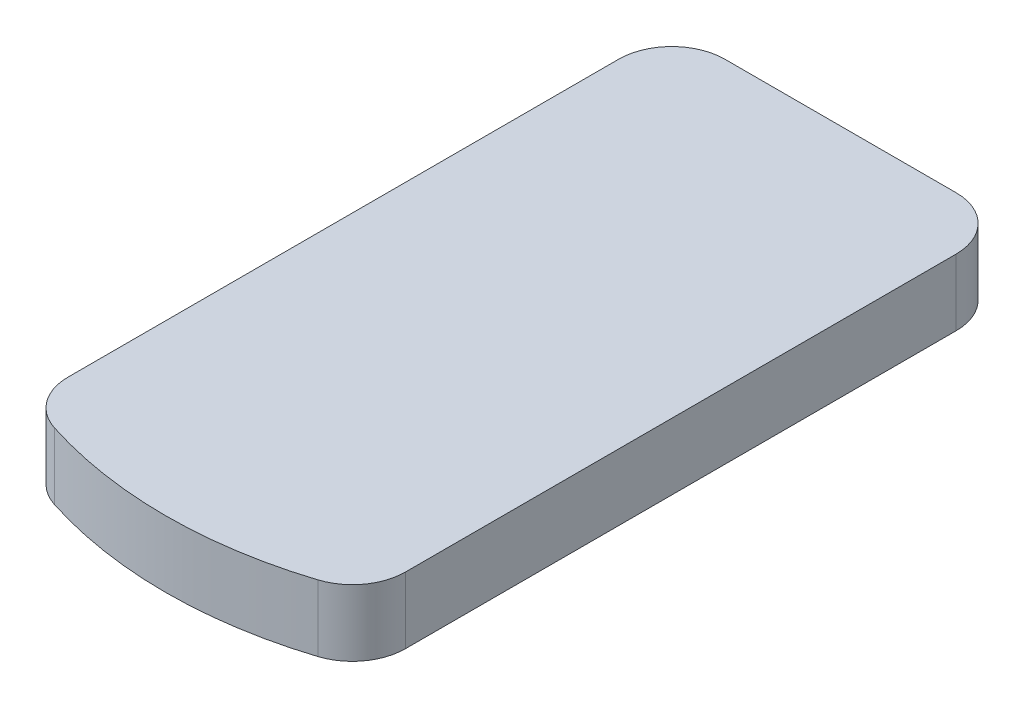
ISO-10303-21;
HEADER;
FILE_DESCRIPTION(('STEP AP214'),'2;1');
FILE_NAME('part.step','',(''),(''),'','','');
FILE_SCHEMA(('AUTOMOTIVE_DESIGN { 1 0 10303 214 1 1 1 1 }'));
ENDSEC;
DATA;
#1=APPLICATION_CONTEXT('core data for automotive mechanical design processes');
#2=APPLICATION_PROTOCOL_DEFINITION('international standard','automotive_design',2000,#1);
#3=PRODUCT_CONTEXT('',#1,'mechanical');
#4=PRODUCT('Part','Part','',(#3));
#5=PRODUCT_RELATED_PRODUCT_CATEGORY('part','',(#4));
#6=PRODUCT_DEFINITION_FORMATION('','',#4);
#7=PRODUCT_DEFINITION_CONTEXT('part definition',#1,'design');
#8=PRODUCT_DEFINITION('design','',#6,#7);
#9=PRODUCT_DEFINITION_SHAPE('','',#8);
#10=(LENGTH_UNIT() NAMED_UNIT(*) SI_UNIT(.MILLI.,.METRE.));
#11=(NAMED_UNIT(*) PLANE_ANGLE_UNIT() SI_UNIT($,.RADIAN.));
#12=(NAMED_UNIT(*) SI_UNIT($,.STERADIAN.) SOLID_ANGLE_UNIT());
#13=UNCERTAINTY_MEASURE_WITH_UNIT(LENGTH_MEASURE(1.E-05),#10,'distance_accuracy_value','');
#14=(GEOMETRIC_REPRESENTATION_CONTEXT(3) GLOBAL_UNCERTAINTY_ASSIGNED_CONTEXT((#13)) GLOBAL_UNIT_ASSIGNED_CONTEXT((#10,
#11,#12)) REPRESENTATION_CONTEXT('',''));
#15=CARTESIAN_POINT('',(0.,0.,0.));
#16=DIRECTION('',(0.,0.,1.));
#17=DIRECTION('',(1.,0.,0.));
#18=AXIS2_PLACEMENT_3D('',#15,#16,#17);
#19=CARTESIAN_POINT('',(-31.75,6.25,127.));
#20=DIRECTION('',(0.,-1.,0.));
#21=DIRECTION('',(0.,0.,-1.));
#22=AXIS2_PLACEMENT_3D('',#19,#20,#21);
#23=PLANE('',#22);
#24=DIRECTION('',(0.,0.,-1.));
#25=VECTOR('',#24,1.);
#26=CARTESIAN_POINT('',(-31.75,6.25,127.));
#27=LINE('',#26,#25);
#28=CARTESIAN_POINT('',(-31.75,6.25,113.598859454336));
#29=VERTEX_POINT('',#28);
#30=CARTESIAN_POINT('',(-31.75,6.25,9.99999999999999));
#31=VERTEX_POINT('',#30);
#32=EDGE_CURVE('E133',#29,#31,#27,.T.);
#33=ORIENTED_EDGE('',*,*,#32,.F.);
#34=CARTESIAN_POINT('',(-21.75,6.25000000000001,113.598859454336));
#35=DIRECTION('',(0.,-1.,0.));
#36=DIRECTION('',(0.,0.,-1.));
#37=AXIS2_PLACEMENT_3D('',#34,#35,#36);
#38=CIRCLE('',#37,10.);
#39=CARTESIAN_POINT('',(-24.8028348487516,6.25,123.121474609127));
#40=VERTEX_POINT('',#39);
#41=EDGE_CURVE('E115',#29,#40,#38,.F.);
#42=ORIENTED_EDGE('',*,*,#41,.T.);
#43=CARTESIAN_POINT('',(0.,6.25,45.7547441064685));
#44=DIRECTION('',(0.,1.,0.));
#45=DIRECTION('',(0.,0.,1.));
#46=AXIS2_PLACEMENT_3D('',#43,#44,#45);
#47=CIRCLE('',#46,81.2452558935315);
#48=CARTESIAN_POINT('',(24.8028348487516,6.25,123.121474609127));
#49=VERTEX_POINT('',#48);
#50=EDGE_CURVE('E182',#40,#49,#47,.T.);
#51=ORIENTED_EDGE('',*,*,#50,.T.);
#52=CARTESIAN_POINT('',(21.75,6.25000000000001,113.598859454336));
#53=DIRECTION('',(0.,-1.,0.));
#54=DIRECTION('',(0.,0.,-1.));
#55=AXIS2_PLACEMENT_3D('',#52,#53,#54);
#56=CIRCLE('',#55,10.);
#57=CARTESIAN_POINT('',(31.75,6.25,113.598859454336));
#58=VERTEX_POINT('',#57);
#59=EDGE_CURVE('E126',#49,#58,#56,.F.);
#60=ORIENTED_EDGE('',*,*,#59,.T.);
#61=DIRECTION('',(0.,0.,-1.));
#62=VECTOR('',#61,1.);
#63=CARTESIAN_POINT('',(31.75,6.25,127.));
#64=LINE('',#63,#62);
#65=CARTESIAN_POINT('',(31.75,6.25,9.99999999999999));
#66=VERTEX_POINT('',#65);
#67=EDGE_CURVE('E141',#58,#66,#64,.T.);
#68=ORIENTED_EDGE('',*,*,#67,.T.);
#69=CARTESIAN_POINT('',(21.75,6.25,9.99999999999999));
#70=DIRECTION('',(0.,-1.,0.));
#71=DIRECTION('',(0.,0.,-1.));
#72=AXIS2_PLACEMENT_3D('',#69,#70,#71);
#73=CIRCLE('',#72,10.);
#74=CARTESIAN_POINT('',(21.75,6.25,0.));
#75=VERTEX_POINT('',#74);
#76=EDGE_CURVE('E151',#66,#75,#73,.F.);
#77=ORIENTED_EDGE('',*,*,#76,.T.);
#78=DIRECTION('',(-1.,0.,0.));
#79=VECTOR('',#78,1.);
#80=CARTESIAN_POINT('',(-31.75,6.25,0.));
#81=LINE('',#80,#79);
#82=CARTESIAN_POINT('',(-21.75,6.25,0.));
#83=VERTEX_POINT('',#82);
#84=EDGE_CURVE('E170',#75,#83,#81,.T.);
#85=ORIENTED_EDGE('',*,*,#84,.T.);
#86=CARTESIAN_POINT('',(-21.75,6.25,9.99999999999999));
#87=DIRECTION('',(0.,-1.,0.));
#88=DIRECTION('',(0.,0.,-1.));
#89=AXIS2_PLACEMENT_3D('',#86,#87,#88);
#90=CIRCLE('',#89,10.);
#91=EDGE_CURVE('E136',#83,#31,#90,.F.);
#92=ORIENTED_EDGE('',*,*,#91,.T.);
#93=EDGE_LOOP('',(#33,#42,#51,#60,#68,#77,#85,#92));
#94=FACE_BOUND('',#93,.T.);
#95=ADVANCED_FACE('F51',(#94),#23,.F.);
#96=CARTESIAN_POINT('',(-31.75,-6.25,127.));
#97=DIRECTION('',(0.,1.,0.));
#98=DIRECTION('',(0.,0.,1.));
#99=AXIS2_PLACEMENT_3D('',#96,#97,#98);
#100=PLANE('',#99);
#101=CARTESIAN_POINT('',(0.,-6.25000000000001,45.7547441064685));
#102=DIRECTION('',(0.,1.,0.));
#103=DIRECTION('',(0.,0.,1.));
#104=AXIS2_PLACEMENT_3D('',#101,#102,#103);
#105=CIRCLE('',#104,81.2452558935315);
#106=CARTESIAN_POINT('',(-24.8028348487516,-6.25000000000001,123.121474609127));
#107=VERTEX_POINT('',#106);
#108=CARTESIAN_POINT('',(24.8028348487516,-6.25000000000001,123.121474609127));
#109=VERTEX_POINT('',#108);
#110=EDGE_CURVE('E173',#107,#109,#105,.T.);
#111=ORIENTED_EDGE('',*,*,#110,.F.);
#112=CARTESIAN_POINT('',(-21.75,-6.25000000000001,113.598859454336));
#113=DIRECTION('',(0.,1.,0.));
#114=DIRECTION('',(0.,0.,1.));
#115=AXIS2_PLACEMENT_3D('',#112,#113,#114);
#116=CIRCLE('',#115,10.);
#117=CARTESIAN_POINT('',(-31.75,-6.25,113.598859454336));
#118=VERTEX_POINT('',#117);
#119=EDGE_CURVE('E162',#107,#118,#116,.F.);
#120=ORIENTED_EDGE('',*,*,#119,.T.);
#121=DIRECTION('',(0.,0.,-1.));
#122=VECTOR('',#121,1.);
#123=CARTESIAN_POINT('',(-31.75,-6.25,127.));
#124=LINE('',#123,#122);
#125=CARTESIAN_POINT('',(-31.75,-6.25,9.99999999999999));
#126=VERTEX_POINT('',#125);
#127=EDGE_CURVE('E135',#118,#126,#124,.T.);
#128=ORIENTED_EDGE('',*,*,#127,.T.);
#129=CARTESIAN_POINT('',(-21.75,-6.25,9.99999999999999));
#130=DIRECTION('',(0.,1.,0.));
#131=DIRECTION('',(0.,0.,1.));
#132=AXIS2_PLACEMENT_3D('',#129,#130,#131);
#133=CIRCLE('',#132,10.);
#134=CARTESIAN_POINT('',(-21.75,-6.25,0.));
#135=VERTEX_POINT('',#134);
#136=EDGE_CURVE('E71',#126,#135,#133,.F.);
#137=ORIENTED_EDGE('',*,*,#136,.T.);
#138=DIRECTION('',(1.,0.,0.));
#139=VECTOR('',#138,1.);
#140=CARTESIAN_POINT('',(-31.75,-6.25,0.));
#141=LINE('',#140,#139);
#142=CARTESIAN_POINT('',(21.75,-6.25,0.));
#143=VERTEX_POINT('',#142);
#144=EDGE_CURVE('E171',#135,#143,#141,.T.);
#145=ORIENTED_EDGE('',*,*,#144,.T.);
#146=CARTESIAN_POINT('',(21.75,-6.25,9.99999999999999));
#147=DIRECTION('',(0.,1.,0.));
#148=DIRECTION('',(0.,0.,1.));
#149=AXIS2_PLACEMENT_3D('',#146,#147,#148);
#150=CIRCLE('',#149,10.);
#151=CARTESIAN_POINT('',(31.75,-6.25,9.99999999999999));
#152=VERTEX_POINT('',#151);
#153=EDGE_CURVE('E158',#143,#152,#150,.F.);
#154=ORIENTED_EDGE('',*,*,#153,.T.);
#155=DIRECTION('',(0.,0.,-1.));
#156=VECTOR('',#155,1.);
#157=CARTESIAN_POINT('',(31.75,-6.25,127.));
#158=LINE('',#157,#156);
#159=CARTESIAN_POINT('',(31.75,-6.25,113.598859454336));
#160=VERTEX_POINT('',#159);
#161=EDGE_CURVE('E145',#160,#152,#158,.T.);
#162=ORIENTED_EDGE('',*,*,#161,.F.);
#163=CARTESIAN_POINT('',(21.75,-6.25000000000001,113.598859454336));
#164=DIRECTION('',(0.,1.,0.));
#165=DIRECTION('',(0.,0.,1.));
#166=AXIS2_PLACEMENT_3D('',#163,#164,#165);
#167=CIRCLE('',#166,10.);
#168=EDGE_CURVE('E160',#160,#109,#167,.F.);
#169=ORIENTED_EDGE('',*,*,#168,.T.);
#170=EDGE_LOOP('',(#111,#120,#128,#137,#145,#154,#162,#169));
#171=FACE_BOUND('',#170,.T.);
#172=ADVANCED_FACE('F176',(#171),#100,.F.);
#173=CARTESIAN_POINT('',(31.75,-6.25,127.));
#174=DIRECTION('',(-1.,0.,0.));
#175=DIRECTION('',(0.,0.,1.));
#176=AXIS2_PLACEMENT_3D('',#173,#174,#175);
#177=PLANE('',#176);
#178=ORIENTED_EDGE('',*,*,#67,.F.);
#179=DIRECTION('',(0.,-1.,0.));
#180=VECTOR('',#179,1.);
#181=CARTESIAN_POINT('',(31.75,-6.24999999999999,113.598859454336));
#182=LINE('',#181,#180);
#183=EDGE_CURVE('E167',#58,#160,#182,.T.);
#184=ORIENTED_EDGE('',*,*,#183,.T.);
#185=ORIENTED_EDGE('',*,*,#161,.T.);
#186=DIRECTION('',(0.,1.,0.));
#187=VECTOR('',#186,1.);
#188=CARTESIAN_POINT('',(31.75,6.25,9.99999999999999));
#189=LINE('',#188,#187);
#190=EDGE_CURVE('E164',#152,#66,#189,.T.);
#191=ORIENTED_EDGE('',*,*,#190,.T.);
#192=EDGE_LOOP('',(#178,#184,#185,#191));
#193=FACE_BOUND('',#192,.T.);
#194=ADVANCED_FACE('F190',(#193),#177,.F.);
#195=CARTESIAN_POINT('',(-31.75,-6.25,127.));
#196=DIRECTION('',(1.,0.,0.));
#197=DIRECTION('',(0.,0.,-1.));
#198=AXIS2_PLACEMENT_3D('',#195,#196,#197);
#199=PLANE('',#198);
#200=ORIENTED_EDGE('',*,*,#127,.F.);
#201=DIRECTION('',(0.,-1.,0.));
#202=VECTOR('',#201,1.);
#203=CARTESIAN_POINT('',(-31.75,6.25000000000001,113.598859454336));
#204=LINE('',#203,#202);
#205=EDGE_CURVE('E119',#118,#29,#204,.F.);
#206=ORIENTED_EDGE('',*,*,#205,.T.);
#207=ORIENTED_EDGE('',*,*,#32,.T.);
#208=DIRECTION('',(0.,-1.,0.));
#209=VECTOR('',#208,1.);
#210=CARTESIAN_POINT('',(-31.75,-6.25,9.99999999999999));
#211=LINE('',#210,#209);
#212=EDGE_CURVE('E137',#31,#126,#211,.T.);
#213=ORIENTED_EDGE('',*,*,#212,.T.);
#214=EDGE_LOOP('',(#200,#206,#207,#213));
#215=FACE_BOUND('',#214,.T.);
#216=ADVANCED_FACE('F131',(#215),#199,.F.);
#217=CARTESIAN_POINT('',(0.,0.,0.));
#218=DIRECTION('',(0.,0.,-1.));
#219=DIRECTION('',(-1.,0.,0.));
#220=AXIS2_PLACEMENT_3D('',#217,#218,#219);
#221=PLANE('',#220);
#222=ORIENTED_EDGE('',*,*,#84,.F.);
#223=DIRECTION('',(0.,1.,0.));
#224=VECTOR('',#223,1.);
#225=CARTESIAN_POINT('',(21.75,-6.25,0.));
#226=LINE('',#225,#224);
#227=EDGE_CURVE('E12',#75,#143,#226,.F.);
#228=ORIENTED_EDGE('',*,*,#227,.T.);
#229=ORIENTED_EDGE('',*,*,#144,.F.);
#230=DIRECTION('',(0.,-1.,0.));
#231=VECTOR('',#230,1.);
#232=CARTESIAN_POINT('',(-21.75,6.25,0.));
#233=LINE('',#232,#231);
#234=EDGE_CURVE('E59',#135,#83,#233,.F.);
#235=ORIENTED_EDGE('',*,*,#234,.T.);
#236=EDGE_LOOP('',(#222,#228,#229,#235));
#237=FACE_BOUND('',#236,.T.);
#238=ADVANCED_FACE('F169',(#237),#221,.T.);
#239=CARTESIAN_POINT('',(0.,-120.75,45.7547441064685));
#240=DIRECTION('',(0.,1.,0.));
#241=DIRECTION('',(0.,0.,1.));
#242=AXIS2_PLACEMENT_3D('',#239,#240,#241);
#243=CYLINDRICAL_SURFACE('',#242,81.2452558935315);
#244=ORIENTED_EDGE('',*,*,#50,.F.);
#245=DIRECTION('',(0.,1.,0.));
#246=VECTOR('',#245,1.);
#247=CARTESIAN_POINT('',(-24.8028348487516,-120.75,123.121474609127));
#248=LINE('',#247,#246);
#249=EDGE_CURVE('E120',#40,#107,#248,.F.);
#250=ORIENTED_EDGE('',*,*,#249,.T.);
#251=ORIENTED_EDGE('',*,*,#110,.T.);
#252=DIRECTION('',(0.,1.,0.));
#253=VECTOR('',#252,1.);
#254=CARTESIAN_POINT('',(24.8028348487516,-120.75,123.121474609127));
#255=LINE('',#254,#253);
#256=EDGE_CURVE('E125',#109,#49,#255,.T.);
#257=ORIENTED_EDGE('',*,*,#256,.T.);
#258=EDGE_LOOP('',(#244,#250,#251,#257));
#259=FACE_BOUND('',#258,.T.);
#260=ADVANCED_FACE('F214',(#259),#243,.T.);
#261=CARTESIAN_POINT('',(-21.75,-120.75,113.598859454336));
#262=DIRECTION('',(0.,1.,0.));
#263=DIRECTION('',(0.,0.,1.));
#264=AXIS2_PLACEMENT_3D('',#261,#262,#263);
#265=CYLINDRICAL_SURFACE('',#264,10.);
#266=ORIENTED_EDGE('',*,*,#119,.F.);
#267=ORIENTED_EDGE('',*,*,#249,.F.);
#268=ORIENTED_EDGE('',*,*,#41,.F.);
#269=ORIENTED_EDGE('',*,*,#205,.F.);
#270=EDGE_LOOP('',(#266,#267,#268,#269));
#271=FACE_BOUND('',#270,.T.);
#272=ADVANCED_FACE('F118',(#271),#265,.T.);
#273=CARTESIAN_POINT('',(21.75,-120.75,113.598859454336));
#274=DIRECTION('',(0.,1.,0.));
#275=DIRECTION('',(0.,0.,1.));
#276=AXIS2_PLACEMENT_3D('',#273,#274,#275);
#277=CYLINDRICAL_SURFACE('',#276,10.);
#278=ORIENTED_EDGE('',*,*,#168,.F.);
#279=ORIENTED_EDGE('',*,*,#183,.F.);
#280=ORIENTED_EDGE('',*,*,#59,.F.);
#281=ORIENTED_EDGE('',*,*,#256,.F.);
#282=EDGE_LOOP('',(#278,#279,#280,#281));
#283=FACE_BOUND('',#282,.T.);
#284=ADVANCED_FACE('F196',(#283),#277,.T.);
#285=CARTESIAN_POINT('',(21.75,-6.25,9.99999999999999));
#286=DIRECTION('',(0.,-1.,0.));
#287=DIRECTION('',(0.,0.,-1.));
#288=AXIS2_PLACEMENT_3D('',#285,#286,#287);
#289=CYLINDRICAL_SURFACE('',#288,10.);
#290=ORIENTED_EDGE('',*,*,#153,.F.);
#291=ORIENTED_EDGE('',*,*,#227,.F.);
#292=ORIENTED_EDGE('',*,*,#76,.F.);
#293=ORIENTED_EDGE('',*,*,#190,.F.);
#294=EDGE_LOOP('',(#290,#291,#292,#293));
#295=FACE_BOUND('',#294,.T.);
#296=ADVANCED_FACE('F194',(#295),#289,.T.);
#297=CARTESIAN_POINT('',(-21.75,-6.25,9.99999999999999));
#298=DIRECTION('',(0.,1.,0.));
#299=DIRECTION('',(0.,0.,1.));
#300=AXIS2_PLACEMENT_3D('',#297,#298,#299);
#301=CYLINDRICAL_SURFACE('',#300,10.);
#302=ORIENTED_EDGE('',*,*,#91,.F.);
#303=ORIENTED_EDGE('',*,*,#234,.F.);
#304=ORIENTED_EDGE('',*,*,#136,.F.);
#305=ORIENTED_EDGE('',*,*,#212,.F.);
#306=EDGE_LOOP('',(#302,#303,#304,#305));
#307=FACE_BOUND('',#306,.T.);
#308=ADVANCED_FACE('F53',(#307),#301,.T.);
#309=CLOSED_SHELL('',(#95,#172,#194,#216,#238,#260,#272,#284,#296,#308));
#310=MANIFOLD_SOLID_BREP('B2',#309);
#311=ADVANCED_BREP_SHAPE_REPRESENTATION('',(#18,#310),#14);
#312=SHAPE_DEFINITION_REPRESENTATION(#9,#311);
ENDSEC;
END-ISO-10303-21;
